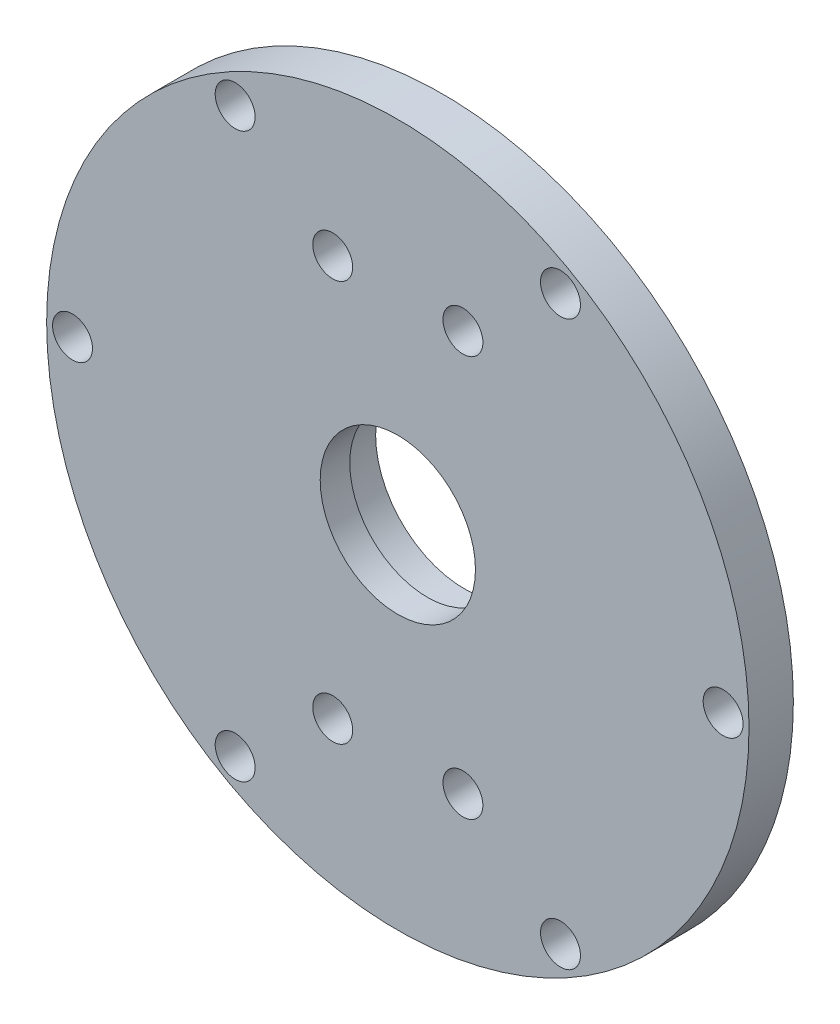
ISO-10303-21;
HEADER;
FILE_DESCRIPTION(('STEP AP214'),'2;1');
FILE_NAME('part.step','',(''),(''),'','','');
FILE_SCHEMA(('AUTOMOTIVE_DESIGN { 1 0 10303 214 1 1 1 1 }'));
ENDSEC;
DATA;
#1=APPLICATION_CONTEXT('core data for automotive mechanical design processes');
#2=APPLICATION_PROTOCOL_DEFINITION('international standard','automotive_design',2000,#1);
#3=PRODUCT_CONTEXT('',#1,'mechanical');
#4=PRODUCT('Part','Part','',(#3));
#5=PRODUCT_RELATED_PRODUCT_CATEGORY('part','',(#4));
#6=PRODUCT_DEFINITION_FORMATION('','',#4);
#7=PRODUCT_DEFINITION_CONTEXT('part definition',#1,'design');
#8=PRODUCT_DEFINITION('design','',#6,#7);
#9=PRODUCT_DEFINITION_SHAPE('','',#8);
#10=(LENGTH_UNIT() NAMED_UNIT(*) SI_UNIT(.MILLI.,.METRE.));
#11=(NAMED_UNIT(*) PLANE_ANGLE_UNIT() SI_UNIT($,.RADIAN.));
#12=(NAMED_UNIT(*) SI_UNIT($,.STERADIAN.) SOLID_ANGLE_UNIT());
#13=UNCERTAINTY_MEASURE_WITH_UNIT(LENGTH_MEASURE(1.E-05),#10,'distance_accuracy_value','');
#14=(GEOMETRIC_REPRESENTATION_CONTEXT(3) GLOBAL_UNCERTAINTY_ASSIGNED_CONTEXT((#13)) GLOBAL_UNIT_ASSIGNED_CONTEXT((#10,
#11,#12)) REPRESENTATION_CONTEXT('',''));
#15=CARTESIAN_POINT('',(0.,0.,0.));
#16=DIRECTION('',(0.,0.,1.));
#17=DIRECTION('',(1.,0.,0.));
#18=AXIS2_PLACEMENT_3D('',#15,#16,#17);
#19=CARTESIAN_POINT('',(0.,0.,0.));
#20=DIRECTION('',(0.,0.,1.));
#21=DIRECTION('',(1.,0.,0.));
#22=AXIS2_PLACEMENT_3D('',#19,#20,#21);
#23=PLANE('',#22);
#24=CARTESIAN_POINT('',(22.,38.1051177665153,0.));
#25=DIRECTION('',(0.,0.,1.));
#26=DIRECTION('',(1.,0.,0.));
#27=AXIS2_PLACEMENT_3D('',#24,#25,#26);
#28=CIRCLE('',#27,2.7);
#29=CARTESIAN_POINT('',(24.7,38.1051177665153,0.));
#30=VERTEX_POINT('',#29);
#31=EDGE_CURVE('E54',#30,#30,#28,.T.);
#32=ORIENTED_EDGE('',*,*,#31,.T.);
#33=EDGE_LOOP('',(#32));
#34=FACE_BOUND('',#33,.T.);
#35=CARTESIAN_POINT('',(-22.,38.1051177665153,0.));
#36=DIRECTION('',(0.,0.,1.));
#37=DIRECTION('',(1.,0.,0.));
#38=AXIS2_PLACEMENT_3D('',#35,#36,#37);
#39=CIRCLE('',#38,2.7);
#40=CARTESIAN_POINT('',(-19.3,38.1051177665153,0.));
#41=VERTEX_POINT('',#40);
#42=EDGE_CURVE('E72',#41,#41,#39,.T.);
#43=ORIENTED_EDGE('',*,*,#42,.T.);
#44=EDGE_LOOP('',(#43));
#45=FACE_BOUND('',#44,.T.);
#46=CARTESIAN_POINT('',(-44.,0.,0.));
#47=DIRECTION('',(0.,0.,1.));
#48=DIRECTION('',(1.,0.,0.));
#49=AXIS2_PLACEMENT_3D('',#46,#47,#48);
#50=CIRCLE('',#49,2.7);
#51=CARTESIAN_POINT('',(-41.3,0.,0.));
#52=VERTEX_POINT('',#51);
#53=EDGE_CURVE('E77',#52,#52,#50,.T.);
#54=ORIENTED_EDGE('',*,*,#53,.T.);
#55=EDGE_LOOP('',(#54));
#56=FACE_BOUND('',#55,.T.);
#57=CARTESIAN_POINT('',(-22.,-38.1051177665153,0.));
#58=DIRECTION('',(0.,0.,1.));
#59=DIRECTION('',(1.,0.,0.));
#60=AXIS2_PLACEMENT_3D('',#57,#58,#59);
#61=CIRCLE('',#60,2.7);
#62=CARTESIAN_POINT('',(-19.3,-38.1051177665153,0.));
#63=VERTEX_POINT('',#62);
#64=EDGE_CURVE('E83',#63,#63,#61,.T.);
#65=ORIENTED_EDGE('',*,*,#64,.T.);
#66=EDGE_LOOP('',(#65));
#67=FACE_BOUND('',#66,.T.);
#68=CARTESIAN_POINT('',(22.,-38.1051177665153,0.));
#69=DIRECTION('',(0.,0.,1.));
#70=DIRECTION('',(1.,0.,0.));
#71=AXIS2_PLACEMENT_3D('',#68,#69,#70);
#72=CIRCLE('',#71,2.7);
#73=CARTESIAN_POINT('',(24.7,-38.1051177665153,0.));
#74=VERTEX_POINT('',#73);
#75=EDGE_CURVE('E89',#74,#74,#72,.T.);
#76=ORIENTED_EDGE('',*,*,#75,.T.);
#77=EDGE_LOOP('',(#76));
#78=FACE_BOUND('',#77,.T.);
#79=CARTESIAN_POINT('',(44.,0.,0.));
#80=DIRECTION('',(0.,0.,1.));
#81=DIRECTION('',(1.,0.,0.));
#82=AXIS2_PLACEMENT_3D('',#79,#80,#81);
#83=CIRCLE('',#82,2.7);
#84=CARTESIAN_POINT('',(46.7,0.,0.));
#85=VERTEX_POINT('',#84);
#86=EDGE_CURVE('E95',#85,#85,#83,.T.);
#87=ORIENTED_EDGE('',*,*,#86,.T.);
#88=EDGE_LOOP('',(#87));
#89=FACE_BOUND('',#88,.T.);
#90=CARTESIAN_POINT('',(0.,0.,0.));
#91=DIRECTION('',(0.,0.,1.));
#92=DIRECTION('',(1.,0.,0.));
#93=AXIS2_PLACEMENT_3D('',#90,#91,#92);
#94=CIRCLE('',#93,47.5);
#95=CARTESIAN_POINT('',(47.5,0.,0.));
#96=VERTEX_POINT('',#95);
#97=EDGE_CURVE('E43',#96,#96,#94,.T.);
#98=ORIENTED_EDGE('',*,*,#97,.F.);
#99=EDGE_LOOP('',(#98));
#100=FACE_BOUND('',#99,.T.);
#101=CARTESIAN_POINT('',(0.,0.,0.));
#102=DIRECTION('',(0.,0.,1.));
#103=DIRECTION('',(1.,0.,0.));
#104=AXIS2_PLACEMENT_3D('',#101,#102,#103);
#105=CIRCLE('',#104,16.);
#106=CARTESIAN_POINT('',(16.,0.,0.));
#107=VERTEX_POINT('',#106);
#108=EDGE_CURVE('E10',#107,#107,#105,.F.);
#109=ORIENTED_EDGE('',*,*,#108,.F.);
#110=EDGE_LOOP('',(#109));
#111=FACE_BOUND('',#110,.T.);
#112=ADVANCED_FACE('F32',(#34,#45,#56,#67,#78,#89,#100,#111),#23,.F.);
#113=CARTESIAN_POINT('',(0.,0.,6.));
#114=DIRECTION('',(0.,0.,-1.));
#115=DIRECTION('',(-1.,0.,0.));
#116=AXIS2_PLACEMENT_3D('',#113,#114,#115);
#117=CYLINDRICAL_SURFACE('',#116,10.5);
#118=CARTESIAN_POINT('',(0.,0.,6.));
#119=DIRECTION('',(0.,0.,1.));
#120=DIRECTION('',(1.,0.,0.));
#121=AXIS2_PLACEMENT_3D('',#118,#119,#120);
#122=CIRCLE('',#121,10.5);
#123=CARTESIAN_POINT('',(10.5,0.,6.));
#124=VERTEX_POINT('',#123);
#125=EDGE_CURVE('E48',#124,#124,#122,.T.);
#126=ORIENTED_EDGE('',*,*,#125,.T.);
#127=EDGE_LOOP('',(#126));
#128=FACE_BOUND('',#127,.T.);
#129=CARTESIAN_POINT('',(0.,0.,2.));
#130=DIRECTION('',(0.,0.,-1.));
#131=DIRECTION('',(-1.,0.,0.));
#132=AXIS2_PLACEMENT_3D('',#129,#130,#131);
#133=CIRCLE('',#132,10.5);
#134=CARTESIAN_POINT('',(-10.5,0.,2.));
#135=VERTEX_POINT('',#134);
#136=EDGE_CURVE('E52',#135,#135,#133,.T.);
#137=ORIENTED_EDGE('',*,*,#136,.T.);
#138=EDGE_LOOP('',(#137));
#139=FACE_BOUND('',#138,.T.);
#140=ADVANCED_FACE('F121',(#128,#139),#117,.F.);
#141=CARTESIAN_POINT('',(0.,0.,6.));
#142=DIRECTION('',(0.,0.,1.));
#143=DIRECTION('',(1.,0.,0.));
#144=AXIS2_PLACEMENT_3D('',#141,#142,#143);
#145=PLANE('',#144);
#146=CARTESIAN_POINT('',(-8.80698433968602,27.1051107144119,6.));
#147=DIRECTION('',(0.,0.,1.));
#148=DIRECTION('',(-1.,0.,0.));
#149=AXIS2_PLACEMENT_3D('',#146,#147,#148);
#150=CIRCLE('',#149,2.7);
#151=CARTESIAN_POINT('',(-11.506984339686,27.1051107144119,6.));
#152=VERTEX_POINT('',#151);
#153=EDGE_CURVE('E136',#152,#152,#150,.T.);
#154=ORIENTED_EDGE('',*,*,#153,.F.);
#155=EDGE_LOOP('',(#154));
#156=FACE_BOUND('',#155,.T.);
#157=CARTESIAN_POINT('',(8.80698433968601,-27.1051107144119,6.));
#158=DIRECTION('',(0.,0.,1.));
#159=DIRECTION('',(-1.,0.,0.));
#160=AXIS2_PLACEMENT_3D('',#157,#158,#159);
#161=CIRCLE('',#160,2.7);
#162=CARTESIAN_POINT('',(6.10698433968602,-27.1051107144119,6.));
#163=VERTEX_POINT('',#162);
#164=EDGE_CURVE('E140',#163,#163,#161,.T.);
#165=ORIENTED_EDGE('',*,*,#164,.F.);
#166=EDGE_LOOP('',(#165));
#167=FACE_BOUND('',#166,.T.);
#168=CARTESIAN_POINT('',(-8.80698433968601,-27.1051107144119,6.));
#169=DIRECTION('',(0.,0.,1.));
#170=DIRECTION('',(1.,0.,0.));
#171=AXIS2_PLACEMENT_3D('',#168,#169,#170);
#172=CIRCLE('',#171,2.7);
#173=CARTESIAN_POINT('',(-6.10698433968602,-27.1051107144119,6.));
#174=VERTEX_POINT('',#173);
#175=EDGE_CURVE('E144',#174,#174,#172,.T.);
#176=ORIENTED_EDGE('',*,*,#175,.F.);
#177=EDGE_LOOP('',(#176));
#178=FACE_BOUND('',#177,.T.);
#179=CARTESIAN_POINT('',(8.80698433968602,27.1051107144119,6.));
#180=DIRECTION('',(0.,0.,1.));
#181=DIRECTION('',(1.,0.,0.));
#182=AXIS2_PLACEMENT_3D('',#179,#180,#181);
#183=CIRCLE('',#182,2.7);
#184=CARTESIAN_POINT('',(11.506984339686,27.1051107144119,6.));
#185=VERTEX_POINT('',#184);
#186=EDGE_CURVE('E148',#185,#185,#183,.T.);
#187=ORIENTED_EDGE('',*,*,#186,.F.);
#188=EDGE_LOOP('',(#187));
#189=FACE_BOUND('',#188,.T.);
#190=CARTESIAN_POINT('',(-22.,38.1051177665153,6.));
#191=DIRECTION('',(0.,0.,1.));
#192=DIRECTION('',(1.,0.,0.));
#193=AXIS2_PLACEMENT_3D('',#190,#191,#192);
#194=CIRCLE('',#193,2.7);
#195=CARTESIAN_POINT('',(-19.3,38.1051177665153,6.));
#196=VERTEX_POINT('',#195);
#197=EDGE_CURVE('E74',#196,#196,#194,.T.);
#198=ORIENTED_EDGE('',*,*,#197,.F.);
#199=EDGE_LOOP('',(#198));
#200=FACE_BOUND('',#199,.T.);
#201=CARTESIAN_POINT('',(-22.,-38.1051177665153,6.));
#202=DIRECTION('',(0.,0.,1.));
#203=DIRECTION('',(1.,0.,0.));
#204=AXIS2_PLACEMENT_3D('',#201,#202,#203);
#205=CIRCLE('',#204,2.7);
#206=CARTESIAN_POINT('',(-19.3,-38.1051177665153,6.));
#207=VERTEX_POINT('',#206);
#208=EDGE_CURVE('E86',#207,#207,#205,.T.);
#209=ORIENTED_EDGE('',*,*,#208,.F.);
#210=EDGE_LOOP('',(#209));
#211=FACE_BOUND('',#210,.T.);
#212=CARTESIAN_POINT('',(44.,0.,6.));
#213=DIRECTION('',(0.,0.,1.));
#214=DIRECTION('',(1.,0.,0.));
#215=AXIS2_PLACEMENT_3D('',#212,#213,#214);
#216=CIRCLE('',#215,2.7);
#217=CARTESIAN_POINT('',(46.7,0.,6.));
#218=VERTEX_POINT('',#217);
#219=EDGE_CURVE('E98',#218,#218,#216,.T.);
#220=ORIENTED_EDGE('',*,*,#219,.F.);
#221=EDGE_LOOP('',(#220));
#222=FACE_BOUND('',#221,.T.);
#223=CARTESIAN_POINT('',(0.,0.,6.));
#224=DIRECTION('',(0.,0.,1.));
#225=DIRECTION('',(1.,0.,0.));
#226=AXIS2_PLACEMENT_3D('',#223,#224,#225);
#227=CIRCLE('',#226,47.5);
#228=CARTESIAN_POINT('',(47.5,0.,6.));
#229=VERTEX_POINT('',#228);
#230=EDGE_CURVE('E39',#229,#229,#227,.T.);
#231=ORIENTED_EDGE('',*,*,#230,.T.);
#232=EDGE_LOOP('',(#231));
#233=FACE_BOUND('',#232,.T.);
#234=ORIENTED_EDGE('',*,*,#125,.F.);
#235=EDGE_LOOP('',(#234));
#236=FACE_BOUND('',#235,.T.);
#237=CARTESIAN_POINT('',(22.,-38.1051177665153,6.));
#238=DIRECTION('',(0.,0.,1.));
#239=DIRECTION('',(1.,0.,0.));
#240=AXIS2_PLACEMENT_3D('',#237,#238,#239);
#241=CIRCLE('',#240,2.7);
#242=CARTESIAN_POINT('',(24.7,-38.1051177665153,6.));
#243=VERTEX_POINT('',#242);
#244=EDGE_CURVE('E92',#243,#243,#241,.T.);
#245=ORIENTED_EDGE('',*,*,#244,.F.);
#246=EDGE_LOOP('',(#245));
#247=FACE_BOUND('',#246,.T.);
#248=CARTESIAN_POINT('',(-44.,0.,6.));
#249=DIRECTION('',(0.,0.,1.));
#250=DIRECTION('',(1.,0.,0.));
#251=AXIS2_PLACEMENT_3D('',#248,#249,#250);
#252=CIRCLE('',#251,2.7);
#253=CARTESIAN_POINT('',(-41.3,0.,6.));
#254=VERTEX_POINT('',#253);
#255=EDGE_CURVE('E80',#254,#254,#252,.T.);
#256=ORIENTED_EDGE('',*,*,#255,.F.);
#257=EDGE_LOOP('',(#256));
#258=FACE_BOUND('',#257,.T.);
#259=CARTESIAN_POINT('',(22.,38.1051177665153,6.));
#260=DIRECTION('',(0.,0.,1.));
#261=DIRECTION('',(1.,0.,0.));
#262=AXIS2_PLACEMENT_3D('',#259,#260,#261);
#263=CIRCLE('',#262,2.7);
#264=CARTESIAN_POINT('',(24.7,38.1051177665153,6.));
#265=VERTEX_POINT('',#264);
#266=EDGE_CURVE('E59',#265,#265,#263,.T.);
#267=ORIENTED_EDGE('',*,*,#266,.F.);
#268=EDGE_LOOP('',(#267));
#269=FACE_BOUND('',#268,.T.);
#270=ADVANCED_FACE('F117',(#156,#167,#178,#189,#200,#211,#222,#233,#236,#247,#258,#269),#145,.T.);
#271=CARTESIAN_POINT('',(0.,0.,6.));
#272=DIRECTION('',(0.,0.,-1.));
#273=DIRECTION('',(-1.,0.,0.));
#274=AXIS2_PLACEMENT_3D('',#271,#272,#273);
#275=CYLINDRICAL_SURFACE('',#274,47.5);
#276=ORIENTED_EDGE('',*,*,#230,.F.);
#277=EDGE_LOOP('',(#276));
#278=FACE_BOUND('',#277,.T.);
#279=ORIENTED_EDGE('',*,*,#97,.T.);
#280=EDGE_LOOP('',(#279));
#281=FACE_BOUND('',#280,.T.);
#282=ADVANCED_FACE('F34',(#278,#281),#275,.T.);
#283=CARTESIAN_POINT('',(44.,0.,6.));
#284=DIRECTION('',(0.,0.,-1.));
#285=DIRECTION('',(-1.,0.,0.));
#286=AXIS2_PLACEMENT_3D('',#283,#284,#285);
#287=CYLINDRICAL_SURFACE('',#286,2.7);
#288=ORIENTED_EDGE('',*,*,#219,.T.);
#289=EDGE_LOOP('',(#288));
#290=FACE_BOUND('',#289,.T.);
#291=ORIENTED_EDGE('',*,*,#86,.F.);
#292=EDGE_LOOP('',(#291));
#293=FACE_BOUND('',#292,.T.);
#294=ADVANCED_FACE('F105',(#290,#293),#287,.F.);
#295=CARTESIAN_POINT('',(22.,-38.1051177665153,6.));
#296=DIRECTION('',(0.,0.,-1.));
#297=DIRECTION('',(-1.,0.,0.));
#298=AXIS2_PLACEMENT_3D('',#295,#296,#297);
#299=CYLINDRICAL_SURFACE('',#298,2.7);
#300=ORIENTED_EDGE('',*,*,#244,.T.);
#301=EDGE_LOOP('',(#300));
#302=FACE_BOUND('',#301,.T.);
#303=ORIENTED_EDGE('',*,*,#75,.F.);
#304=EDGE_LOOP('',(#303));
#305=FACE_BOUND('',#304,.T.);
#306=ADVANCED_FACE('F107',(#302,#305),#299,.F.);
#307=CARTESIAN_POINT('',(-22.,-38.1051177665153,6.));
#308=DIRECTION('',(0.,0.,-1.));
#309=DIRECTION('',(-1.,0.,0.));
#310=AXIS2_PLACEMENT_3D('',#307,#308,#309);
#311=CYLINDRICAL_SURFACE('',#310,2.7);
#312=ORIENTED_EDGE('',*,*,#208,.T.);
#313=EDGE_LOOP('',(#312));
#314=FACE_BOUND('',#313,.T.);
#315=ORIENTED_EDGE('',*,*,#64,.F.);
#316=EDGE_LOOP('',(#315));
#317=FACE_BOUND('',#316,.T.);
#318=ADVANCED_FACE('F114',(#314,#317),#311,.F.);
#319=CARTESIAN_POINT('',(-44.,0.,6.));
#320=DIRECTION('',(0.,0.,-1.));
#321=DIRECTION('',(-1.,0.,0.));
#322=AXIS2_PLACEMENT_3D('',#319,#320,#321);
#323=CYLINDRICAL_SURFACE('',#322,2.7);
#324=ORIENTED_EDGE('',*,*,#255,.T.);
#325=EDGE_LOOP('',(#324));
#326=FACE_BOUND('',#325,.T.);
#327=ORIENTED_EDGE('',*,*,#53,.F.);
#328=EDGE_LOOP('',(#327));
#329=FACE_BOUND('',#328,.T.);
#330=ADVANCED_FACE('F178',(#326,#329),#323,.F.);
#331=CARTESIAN_POINT('',(-22.,38.1051177665153,6.));
#332=DIRECTION('',(0.,0.,-1.));
#333=DIRECTION('',(-1.,0.,0.));
#334=AXIS2_PLACEMENT_3D('',#331,#332,#333);
#335=CYLINDRICAL_SURFACE('',#334,2.7);
#336=ORIENTED_EDGE('',*,*,#197,.T.);
#337=EDGE_LOOP('',(#336));
#338=FACE_BOUND('',#337,.T.);
#339=ORIENTED_EDGE('',*,*,#42,.F.);
#340=EDGE_LOOP('',(#339));
#341=FACE_BOUND('',#340,.T.);
#342=ADVANCED_FACE('F168',(#338,#341),#335,.F.);
#343=CARTESIAN_POINT('',(22.,38.1051177665153,6.));
#344=DIRECTION('',(0.,0.,-1.));
#345=DIRECTION('',(-1.,0.,0.));
#346=AXIS2_PLACEMENT_3D('',#343,#344,#345);
#347=CYLINDRICAL_SURFACE('',#346,2.7);
#348=ORIENTED_EDGE('',*,*,#266,.T.);
#349=EDGE_LOOP('',(#348));
#350=FACE_BOUND('',#349,.T.);
#351=ORIENTED_EDGE('',*,*,#31,.F.);
#352=EDGE_LOOP('',(#351));
#353=FACE_BOUND('',#352,.T.);
#354=ADVANCED_FACE('F164',(#350,#353),#347,.F.);
#355=CARTESIAN_POINT('',(0.,0.,2.));
#356=DIRECTION('',(0.,0.,-1.));
#357=DIRECTION('',(-1.,0.,0.));
#358=AXIS2_PLACEMENT_3D('',#355,#356,#357);
#359=CYLINDRICAL_SURFACE('',#358,12.);
#360=CARTESIAN_POINT('',(0.,0.,2.));
#361=DIRECTION('',(0.,0.,-1.));
#362=DIRECTION('',(-1.,0.,0.));
#363=AXIS2_PLACEMENT_3D('',#360,#361,#362);
#364=CIRCLE('',#363,12.);
#365=CARTESIAN_POINT('',(-12.,0.,2.));
#366=VERTEX_POINT('',#365);
#367=EDGE_CURVE('E55',#366,#366,#364,.T.);
#368=ORIENTED_EDGE('',*,*,#367,.F.);
#369=EDGE_LOOP('',(#368));
#370=FACE_BOUND('',#369,.T.);
#371=CARTESIAN_POINT('',(0.,0.,-3.));
#372=DIRECTION('',(0.,0.,-1.));
#373=DIRECTION('',(-1.,0.,0.));
#374=AXIS2_PLACEMENT_3D('',#371,#372,#373);
#375=CIRCLE('',#374,12.);
#376=CARTESIAN_POINT('',(-12.,0.,-3.));
#377=VERTEX_POINT('',#376);
#378=EDGE_CURVE('E67',#377,#377,#375,.T.);
#379=ORIENTED_EDGE('',*,*,#378,.T.);
#380=EDGE_LOOP('',(#379));
#381=FACE_BOUND('',#380,.T.);
#382=ADVANCED_FACE('F167',(#370,#381),#359,.F.);
#383=CARTESIAN_POINT('',(0.,0.,2.));
#384=DIRECTION('',(0.,0.,-1.));
#385=DIRECTION('',(-1.,0.,0.));
#386=AXIS2_PLACEMENT_3D('',#383,#384,#385);
#387=PLANE('',#386);
#388=ORIENTED_EDGE('',*,*,#136,.F.);
#389=EDGE_LOOP('',(#388));
#390=FACE_BOUND('',#389,.T.);
#391=ORIENTED_EDGE('',*,*,#367,.T.);
#392=EDGE_LOOP('',(#391));
#393=FACE_BOUND('',#392,.T.);
#394=ADVANCED_FACE('F175',(#390,#393),#387,.T.);
#395=CARTESIAN_POINT('',(0.,0.,-3.));
#396=DIRECTION('',(0.,0.,-1.));
#397=DIRECTION('',(-1.,0.,0.));
#398=AXIS2_PLACEMENT_3D('',#395,#396,#397);
#399=PLANE('',#398);
#400=CARTESIAN_POINT('',(0.,0.,-3.));
#401=DIRECTION('',(0.,0.,-1.));
#402=DIRECTION('',(-1.,0.,0.));
#403=AXIS2_PLACEMENT_3D('',#400,#401,#402);
#404=CIRCLE('',#403,16.);
#405=CARTESIAN_POINT('',(-16.,0.,-3.));
#406=VERTEX_POINT('',#405);
#407=EDGE_CURVE('E62',#406,#406,#404,.T.);
#408=ORIENTED_EDGE('',*,*,#407,.T.);
#409=EDGE_LOOP('',(#408));
#410=FACE_BOUND('',#409,.T.);
#411=ORIENTED_EDGE('',*,*,#378,.F.);
#412=EDGE_LOOP('',(#411));
#413=FACE_BOUND('',#412,.T.);
#414=ADVANCED_FACE('F225',(#410,#413),#399,.T.);
#415=CARTESIAN_POINT('',(0.,0.,-3.));
#416=DIRECTION('',(0.,0.,1.));
#417=DIRECTION('',(1.,0.,0.));
#418=AXIS2_PLACEMENT_3D('',#415,#416,#417);
#419=CYLINDRICAL_SURFACE('',#418,16.);
#420=ORIENTED_EDGE('',*,*,#407,.F.);
#421=EDGE_LOOP('',(#420));
#422=FACE_BOUND('',#421,.T.);
#423=ORIENTED_EDGE('',*,*,#108,.T.);
#424=EDGE_LOOP('',(#423));
#425=FACE_BOUND('',#424,.T.);
#426=ADVANCED_FACE('F245',(#422,#425),#419,.T.);
#427=CARTESIAN_POINT('',(8.80698433968602,27.1051107144119,1.));
#428=DIRECTION('',(0.,0.,1.));
#429=DIRECTION('',(1.,0.,0.));
#430=AXIS2_PLACEMENT_3D('',#427,#428,#429);
#431=CYLINDRICAL_SURFACE('',#430,2.7);
#432=CARTESIAN_POINT('',(8.80698433968602,27.1051107144119,1.));
#433=DIRECTION('',(0.,0.,1.));
#434=DIRECTION('',(1.,0.,0.));
#435=AXIS2_PLACEMENT_3D('',#432,#433,#434);
#436=CIRCLE('',#435,2.7);
#437=CARTESIAN_POINT('',(11.506984339686,27.1051107144119,1.));
#438=VERTEX_POINT('',#437);
#439=EDGE_CURVE('E348',#438,#438,#436,.T.);
#440=ORIENTED_EDGE('',*,*,#439,.F.);
#441=EDGE_LOOP('',(#440));
#442=FACE_BOUND('',#441,.T.);
#443=ORIENTED_EDGE('',*,*,#186,.T.);
#444=EDGE_LOOP('',(#443));
#445=FACE_BOUND('',#444,.T.);
#446=ADVANCED_FACE('F254',(#442,#445),#431,.F.);
#447=CARTESIAN_POINT('',(8.80698433968602,27.1051107144119,1.));
#448=DIRECTION('',(0.,0.,1.));
#449=DIRECTION('',(1.,0.,0.));
#450=AXIS2_PLACEMENT_3D('',#447,#448,#449);
#451=PLANE('',#450);
#452=ORIENTED_EDGE('',*,*,#439,.T.);
#453=EDGE_LOOP('',(#452));
#454=FACE_BOUND('',#453,.T.);
#455=ADVANCED_FACE('F270',(#454),#451,.T.);
#456=CARTESIAN_POINT('',(-8.80698433968601,-27.1051107144119,1.));
#457=DIRECTION('',(0.,0.,1.));
#458=DIRECTION('',(1.,0.,0.));
#459=AXIS2_PLACEMENT_3D('',#456,#457,#458);
#460=CYLINDRICAL_SURFACE('',#459,2.7);
#461=CARTESIAN_POINT('',(-8.80698433968601,-27.1051107144119,1.));
#462=DIRECTION('',(0.,0.,1.));
#463=DIRECTION('',(1.,0.,0.));
#464=AXIS2_PLACEMENT_3D('',#461,#462,#463);
#465=CIRCLE('',#464,2.7);
#466=CARTESIAN_POINT('',(-6.10698433968602,-27.1051107144119,1.));
#467=VERTEX_POINT('',#466);
#468=EDGE_CURVE('E358',#467,#467,#465,.T.);
#469=ORIENTED_EDGE('',*,*,#468,.F.);
#470=EDGE_LOOP('',(#469));
#471=FACE_BOUND('',#470,.T.);
#472=ORIENTED_EDGE('',*,*,#175,.T.);
#473=EDGE_LOOP('',(#472));
#474=FACE_BOUND('',#473,.T.);
#475=ADVANCED_FACE('F280',(#471,#474),#460,.F.);
#476=CARTESIAN_POINT('',(-8.80698433968601,-27.1051107144119,1.));
#477=DIRECTION('',(0.,0.,1.));
#478=DIRECTION('',(1.,0.,0.));
#479=AXIS2_PLACEMENT_3D('',#476,#477,#478);
#480=PLANE('',#479);
#481=ORIENTED_EDGE('',*,*,#468,.T.);
#482=EDGE_LOOP('',(#481));
#483=FACE_BOUND('',#482,.T.);
#484=ADVANCED_FACE('F290',(#483),#480,.T.);
#485=CARTESIAN_POINT('',(8.80698433968601,-27.1051107144119,1.));
#486=DIRECTION('',(0.,0.,1.));
#487=DIRECTION('',(1.,0.,0.));
#488=AXIS2_PLACEMENT_3D('',#485,#486,#487);
#489=CYLINDRICAL_SURFACE('',#488,2.7);
#490=CARTESIAN_POINT('',(8.80698433968601,-27.1051107144119,1.));
#491=DIRECTION('',(0.,0.,1.));
#492=DIRECTION('',(-1.,0.,0.));
#493=AXIS2_PLACEMENT_3D('',#490,#491,#492);
#494=CIRCLE('',#493,2.7);
#495=CARTESIAN_POINT('',(6.10698433968602,-27.1051107144119,1.));
#496=VERTEX_POINT('',#495);
#497=EDGE_CURVE('E350',#496,#496,#494,.T.);
#498=ORIENTED_EDGE('',*,*,#497,.F.);
#499=EDGE_LOOP('',(#498));
#500=FACE_BOUND('',#499,.T.);
#501=ORIENTED_EDGE('',*,*,#164,.T.);
#502=EDGE_LOOP('',(#501));
#503=FACE_BOUND('',#502,.T.);
#504=ADVANCED_FACE('F300',(#500,#503),#489,.F.);
#505=CARTESIAN_POINT('',(8.80698433968601,-27.1051107144119,1.));
#506=DIRECTION('',(0.,0.,-1.));
#507=DIRECTION('',(-1.,0.,0.));
#508=AXIS2_PLACEMENT_3D('',#505,#506,#507);
#509=PLANE('',#508);
#510=ORIENTED_EDGE('',*,*,#497,.T.);
#511=EDGE_LOOP('',(#510));
#512=FACE_BOUND('',#511,.T.);
#513=ADVANCED_FACE('F310',(#512),#509,.F.);
#514=CARTESIAN_POINT('',(-8.80698433968602,27.1051107144119,1.));
#515=DIRECTION('',(0.,0.,1.));
#516=DIRECTION('',(1.,0.,0.));
#517=AXIS2_PLACEMENT_3D('',#514,#515,#516);
#518=CYLINDRICAL_SURFACE('',#517,2.7);
#519=CARTESIAN_POINT('',(-8.80698433968602,27.1051107144119,1.));
#520=DIRECTION('',(0.,0.,1.));
#521=DIRECTION('',(-1.,0.,0.));
#522=AXIS2_PLACEMENT_3D('',#519,#520,#521);
#523=CIRCLE('',#522,2.7);
#524=CARTESIAN_POINT('',(-11.506984339686,27.1051107144119,1.));
#525=VERTEX_POINT('',#524);
#526=EDGE_CURVE('E346',#525,#525,#523,.T.);
#527=ORIENTED_EDGE('',*,*,#526,.F.);
#528=EDGE_LOOP('',(#527));
#529=FACE_BOUND('',#528,.T.);
#530=ORIENTED_EDGE('',*,*,#153,.T.);
#531=EDGE_LOOP('',(#530));
#532=FACE_BOUND('',#531,.T.);
#533=ADVANCED_FACE('F320',(#529,#532),#518,.F.);
#534=CARTESIAN_POINT('',(-8.80698433968602,27.1051107144119,1.));
#535=DIRECTION('',(0.,0.,-1.));
#536=DIRECTION('',(-1.,0.,0.));
#537=AXIS2_PLACEMENT_3D('',#534,#535,#536);
#538=PLANE('',#537);
#539=ORIENTED_EDGE('',*,*,#526,.T.);
#540=EDGE_LOOP('',(#539));
#541=FACE_BOUND('',#540,.T.);
#542=ADVANCED_FACE('F330',(#541),#538,.F.);
#543=CLOSED_SHELL('',(#112,#140,#270,#282,#294,#306,#318,#330,#342,#354,#382,#394,#414,#426,
#446,#455,#475,#484,#504,#513,#533,#542));
#544=MANIFOLD_SOLID_BREP('B2',#543);
#545=ADVANCED_BREP_SHAPE_REPRESENTATION('',(#18,#544),#14);
#546=SHAPE_DEFINITION_REPRESENTATION(#9,#545);
ENDSEC;
END-ISO-10303-21;
